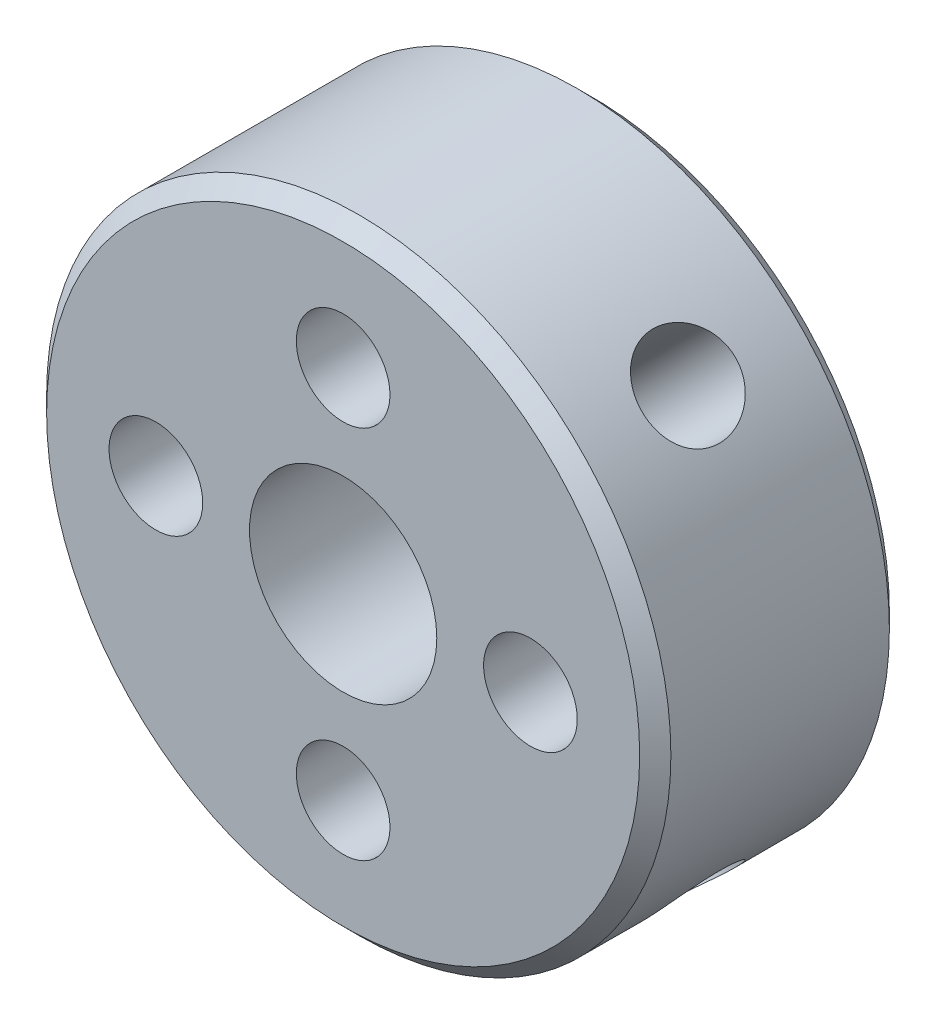
ISO-10303-21;
HEADER;
FILE_DESCRIPTION(('STEP AP214'),'2;1');
FILE_NAME('part.step','',(''),(''),'','','');
FILE_SCHEMA(('AUTOMOTIVE_DESIGN { 1 0 10303 214 1 1 1 1 }'));
ENDSEC;
DATA;
#1=APPLICATION_CONTEXT('core data for automotive mechanical design processes');
#2=APPLICATION_PROTOCOL_DEFINITION('international standard','automotive_design',2000,#1);
#3=PRODUCT_CONTEXT('',#1,'mechanical');
#4=PRODUCT('Part','Part','',(#3));
#5=PRODUCT_RELATED_PRODUCT_CATEGORY('part','',(#4));
#6=PRODUCT_DEFINITION_FORMATION('','',#4);
#7=PRODUCT_DEFINITION_CONTEXT('part definition',#1,'design');
#8=PRODUCT_DEFINITION('design','',#6,#7);
#9=PRODUCT_DEFINITION_SHAPE('','',#8);
#10=(LENGTH_UNIT() NAMED_UNIT(*) SI_UNIT(.MILLI.,.METRE.));
#11=(NAMED_UNIT(*) PLANE_ANGLE_UNIT() SI_UNIT($,.RADIAN.));
#12=(NAMED_UNIT(*) SI_UNIT($,.STERADIAN.) SOLID_ANGLE_UNIT());
#13=UNCERTAINTY_MEASURE_WITH_UNIT(LENGTH_MEASURE(1.E-05),#10,'distance_accuracy_value','');
#14=(GEOMETRIC_REPRESENTATION_CONTEXT(3) GLOBAL_UNCERTAINTY_ASSIGNED_CONTEXT((#13)) GLOBAL_UNIT_ASSIGNED_CONTEXT((#10,
#11,#12)) REPRESENTATION_CONTEXT('',''));
#15=CARTESIAN_POINT('',(0.,0.,0.));
#16=DIRECTION('',(0.,0.,1.));
#17=DIRECTION('',(1.,0.,0.));
#18=AXIS2_PLACEMENT_3D('',#15,#16,#17);
#19=CARTESIAN_POINT('',(0.,0.,8.));
#20=DIRECTION('',(0.,0.,-1.));
#21=DIRECTION('',(-1.,0.,0.));
#22=AXIS2_PLACEMENT_3D('',#19,#20,#21);
#23=CYLINDRICAL_SURFACE('',#22,10.);
#24=CARTESIAN_POINT('',(0.,0.,0.500000000000002));
#25=DIRECTION('',(0.,0.,1.));
#26=DIRECTION('',(1.,0.,0.));
#27=AXIS2_PLACEMENT_3D('',#24,#25,#26);
#28=CIRCLE('',#27,10.);
#29=CARTESIAN_POINT('',(10.,0.,0.500000000000002));
#30=VERTEX_POINT('',#29);
#31=EDGE_CURVE('E42',#30,#30,#28,.T.);
#32=ORIENTED_EDGE('',*,*,#31,.T.);
#33=EDGE_LOOP('',(#32));
#34=FACE_BOUND('',#33,.T.);
#35=CARTESIAN_POINT('',(0.,0.,7.5));
#36=DIRECTION('',(0.,0.,1.));
#37=DIRECTION('',(1.,0.,0.));
#38=AXIS2_PLACEMENT_3D('',#35,#36,#37);
#39=CIRCLE('',#38,10.);
#40=CARTESIAN_POINT('',(10.,0.,7.5));
#41=VERTEX_POINT('',#40);
#42=EDGE_CURVE('E46',#41,#41,#39,.F.);
#43=ORIENTED_EDGE('',*,*,#42,.T.);
#44=EDGE_LOOP('',(#43));
#45=FACE_BOUND('',#44,.T.);
#46=CARTESIAN_POINT('',(5.93040555527496,-8.0517258988346,4.));
#47=CARTESIAN_POINT('',(5.93040899108594,-8.05172444298389,3.91625443071005));
#48=CARTESIAN_POINT('',(5.93614202045911,-8.04751049210588,3.83246024924929));
#49=CARTESIAN_POINT('',(5.95885332008941,-8.03070725438722,3.66721468511687));
#50=CARTESIAN_POINT('',(5.97584255881889,-8.0181097982916,3.58576566851999));
#51=CARTESIAN_POINT('',(6.02035955205701,-7.98473791461494,3.4276262445531));
#52=CARTESIAN_POINT('',(6.04787921857375,-7.96396976226849,3.35093223745785));
#53=CARTESIAN_POINT('',(6.11237336442192,-7.91457730982817,3.20437296922792));
#54=CARTESIAN_POINT('',(6.14934654207741,-7.88595409127691,3.13450676978571));
#55=CARTESIAN_POINT('',(6.23166408721641,-7.82106904568631,3.00301618324567));
#56=CARTESIAN_POINT('',(6.27706649470699,-7.78475399567999,2.94145438659326));
#57=CARTESIAN_POINT('',(6.37442909338175,-7.70523178186016,2.8288625143445));
#58=CARTESIAN_POINT('',(6.42638964489153,-7.66202423931642,2.77783301783301));
#59=CARTESIAN_POINT('',(6.53533339103335,-7.56931634453561,2.68752336830864));
#60=CARTESIAN_POINT('',(6.59233952002671,-7.51978675262899,2.64830084967754));
#61=CARTESIAN_POINT('',(6.70923647587951,-7.41567695049743,2.58308840119183));
#62=CARTESIAN_POINT('',(6.76912715013494,-7.36109700731588,2.55709777215711));
#63=CARTESIAN_POINT('',(6.88939654102741,-7.24865080056696,2.51927661146916));
#64=CARTESIAN_POINT('',(6.94976822170416,-7.19081227463186,2.50734127361284));
#65=CARTESIAN_POINT('',(7.06959508074547,-7.07303897929697,2.49764406517511));
#66=CARTESIAN_POINT('',(7.12905030987486,-7.01310432661308,2.49988140668031));
#67=CARTESIAN_POINT('',(7.24487940676773,-6.89337419593743,2.51838333776243));
#68=CARTESIAN_POINT('',(7.30127417997475,-6.83358146340221,2.53453517179149));
#69=CARTESIAN_POINT('',(7.41004619828203,-6.71547949038114,2.58023060632258));
#70=CARTESIAN_POINT('',(7.46242333993872,-6.65717028811816,2.60977455150144));
#71=CARTESIAN_POINT('',(7.56214337356282,-6.54367798766755,2.6815309969171));
#72=CARTESIAN_POINT('',(7.60946648639261,-6.48850754014474,2.72379096510874));
#73=CARTESIAN_POINT('',(7.69788423704308,-6.38336154841827,2.81974519366999));
#74=CARTESIAN_POINT('',(7.73897846456672,-6.33338634649379,2.87344020670687));
#75=CARTESIAN_POINT('',(7.81455952529844,-6.23989709474696,2.99136844882659));
#76=CARTESIAN_POINT('',(7.84897740417343,-6.19645141998096,3.05570012197012));
#77=CARTESIAN_POINT('',(7.91011579548983,-6.1182138832186,3.19274107712374));
#78=CARTESIAN_POINT('',(7.93683626053028,-6.08342207451324,3.26545041071993));
#79=CARTESIAN_POINT('',(7.98217305968424,-6.02381304647328,3.41728396294065));
#80=CARTESIAN_POINT('',(8.00078306572531,-5.99900361690485,3.49641313366239));
#81=CARTESIAN_POINT('',(8.02957749324963,-5.96040859115874,3.65878525514739));
#82=CARTESIAN_POINT('',(8.03976250854017,-5.94662221806007,3.74202791554676));
#83=CARTESIAN_POINT('',(8.05149378974266,-5.93072894804483,3.90940008957749));
#84=CARTESIAN_POINT('',(8.05312282648841,-5.92851014758075,3.99351318820154));
#85=CARTESIAN_POINT('',(8.04794053203053,-5.93554306966745,4.16099419481734));
#86=CARTESIAN_POINT('',(8.04112946272304,-5.94479443629942,4.24436212585077));
#87=CARTESIAN_POINT('',(8.01922662593605,-5.97430629989806,4.40755981796563));
#88=CARTESIAN_POINT('',(8.00417649164113,-5.99451144092044,4.48740520494161));
#89=CARTESIAN_POINT('',(7.96605027519631,-6.04508394364515,4.64178409204861));
#90=CARTESIAN_POINT('',(7.94297379667765,-6.0754518072152,4.7163173296282));
#91=CARTESIAN_POINT('',(7.88894310849533,-6.14544861409309,4.85857326033505));
#92=CARTESIAN_POINT('',(7.85793089112363,-6.18514556776296,4.92624044727982));
#93=CARTESIAN_POINT('',(7.78861556399052,-6.27220503463211,5.05227285987382));
#94=CARTESIAN_POINT('',(7.75031204195036,-6.31956798127377,5.11063755918116));
#95=CARTESIAN_POINT('',(7.66673645358637,-6.42070736283191,5.21690260663359));
#96=CARTESIAN_POINT('',(7.6214089923518,-6.47453393988641,5.26471172824248));
#97=CARTESIAN_POINT('',(7.52492509881356,-6.58642175261441,5.34787290526265));
#98=CARTESIAN_POINT('',(7.47376882602519,-6.64448287238683,5.38322530146503));
#99=CARTESIAN_POINT('',(7.36697834730602,-6.76268772638434,5.44032374248803));
#100=CARTESIAN_POINT('',(7.31136141742463,-6.82282295626799,5.46211966707837));
#101=CARTESIAN_POINT('',(7.19689080409556,-6.94346258042546,5.49164787953748));
#102=CARTESIAN_POINT('',(7.13803733468611,-7.00396695005269,5.49938109624915));
#103=CARTESIAN_POINT('',(7.01931940397537,-7.12293118201246,5.50054170454941));
#104=CARTESIAN_POINT('',(6.95947052262066,-7.18140527757905,5.49410868087698));
#105=CARTESIAN_POINT('',(6.83996856432094,-7.295316757677,5.46741861157924));
#106=CARTESIAN_POINT('',(6.78031548674997,-7.35075415192535,5.44716161019144));
#107=CARTESIAN_POINT('',(6.66310148888178,-7.45716737725788,5.39344812442977));
#108=CARTESIAN_POINT('',(6.60553907031206,-7.50814644182927,5.36000130486107));
#109=CARTESIAN_POINT('',(6.49431420502485,-7.60455828524601,5.28087251201686));
#110=CARTESIAN_POINT('',(6.44065188499423,-7.6499908839581,5.23519014151966));
#111=CARTESIAN_POINT('',(6.33854232463155,-7.73481317291166,5.13238230117083));
#112=CARTESIAN_POINT('',(6.29014857054964,-7.77414235248672,5.07515377418366));
#113=CARTESIAN_POINT('',(6.20086114735889,-7.84554638422111,4.95109492691953));
#114=CARTESIAN_POINT('',(6.15996924124732,-7.87761953156382,4.88426235617566));
#115=CARTESIAN_POINT('',(6.08700974244396,-7.93413261409575,4.74245101676747));
#116=CARTESIAN_POINT('',(6.05499302685847,-7.95852864371884,4.66742858297817));
#117=CARTESIAN_POINT('',(6.00137997414262,-7.99903602313445,4.5117032232367));
#118=CARTESIAN_POINT('',(5.97977282380163,-8.01515597107382,4.43100629214218));
#119=CARTESIAN_POINT('',(5.95273978437993,-8.03523928527466,4.29162256374353));
#120=CARTESIAN_POINT('',(5.94438140015643,-8.04141644105361,4.23379660307573));
#121=CARTESIAN_POINT('',(5.93321311798502,-8.04966023118407,4.11732170826565));
#122=CARTESIAN_POINT('',(5.93040314811957,-8.05172691881472,4.05867278480039));
#123=CARTESIAN_POINT('',(5.93040555527496,-8.0517258988346,4.));
#124=B_SPLINE_CURVE_WITH_KNOTS('',3,(#46,#47,#48,#49,#50,#51,#52,#53,#54,#55,#56,#57,#58,#59,
#60,#61,#62,#63,#64,#65,#66,#67,#68,#69,#70,#71,#72,#73,#74,#75,#76,#77,#78,#79,#80,#81,#82,#83,
#84,#85,#86,#87,#88,#89,#90,#91,#92,#93,#94,#95,#96,#97,#98,#99,#100,#101,#102,#103,#104,#105,
#106,#107,#108,#109,#110,#111,#112,#113,#114,#115,#116,#117,#118,#119,#120,#121,#122,#123),
.UNSPECIFIED.,.T.,.F.,(4,2,2,2,2,2,2,2,2,2,2,2,2,2,2,2,2,2,2,2,2,2,2,2,2,2,2,2,2,2,2,2,2,2,2,2,
2,2,4),(0.,0.251022251804868,0.502289469561802,0.753364085335673,1.00440414866132,
1.25724158649107,1.51009292207817,1.76415922105782,2.01821209364501,2.27035832534397,
2.52249053939374,2.77259862515728,3.02271314839401,3.27377316386454,3.52484970949272,
3.77839544666269,4.0319427451435,4.28568751773139,4.53941440444341,4.79068214603743,
5.04194209099918,5.29194394807374,5.54195815286117,5.79385486001302,6.04576581461802,
6.29977537753516,6.55377799071854,6.8068404089109,7.05988611170473,7.31044963622327,
7.56101235892823,7.81139182257833,8.06177941567106,8.31450950010969,8.56729890236862,
8.82150878824931,9.07545403445564,9.25132441891613,9.42719252376192),.UNSPECIFIED.);
#125=CARTESIAN_POINT('',(5.93040555527496,-8.0517258988346,4.));
#126=VERTEX_POINT('',#125);
#127=EDGE_CURVE('E90',#126,#126,#124,.T.);
#128=ORIENTED_EDGE('',*,*,#127,.F.);
#129=EDGE_LOOP('',(#128));
#130=FACE_BOUND('',#129,.T.);
#131=CARTESIAN_POINT('',(8.0517258988346,5.93040555527496,4.));
#132=CARTESIAN_POINT('',(8.05172444298389,5.93040899108594,4.08374556928996));
#133=CARTESIAN_POINT('',(8.04751049210588,5.93614202045911,4.16753975075071));
#134=CARTESIAN_POINT('',(8.03070725438722,5.95885332008941,4.33278531488313));
#135=CARTESIAN_POINT('',(8.0181097982916,5.97584255881889,4.41423433148002));
#136=CARTESIAN_POINT('',(7.98473791461494,6.02035955205701,4.5723737554469));
#137=CARTESIAN_POINT('',(7.96396976226849,6.04787921857375,4.64906776254216));
#138=CARTESIAN_POINT('',(7.91457730982817,6.11237336442192,4.79562703077209));
#139=CARTESIAN_POINT('',(7.88595409127691,6.14934654207741,4.8654932302143));
#140=CARTESIAN_POINT('',(7.82106904568631,6.23166408721642,4.99698381675434));
#141=CARTESIAN_POINT('',(7.78475399567998,6.27706649470699,5.05854561340675));
#142=CARTESIAN_POINT('',(7.70523178186016,6.37442909338175,5.17113748565551));
#143=CARTESIAN_POINT('',(7.66202423931642,6.42638964489153,5.22216698216699));
#144=CARTESIAN_POINT('',(7.56931634453561,6.53533339103335,5.31247663169137));
#145=CARTESIAN_POINT('',(7.51978675262899,6.59233952002672,5.35169915032246));
#146=CARTESIAN_POINT('',(7.41567695049743,6.70923647587951,5.41691159880818));
#147=CARTESIAN_POINT('',(7.36109700731588,6.76912715013494,5.4429022278429));
#148=CARTESIAN_POINT('',(7.24865080056696,6.88939654102741,5.48072338853084));
#149=CARTESIAN_POINT('',(7.19081227463186,6.94976822170416,5.49265872638717));
#150=CARTESIAN_POINT('',(7.07303897929697,7.06959508074547,5.5023559348249));
#151=CARTESIAN_POINT('',(7.01310432661308,7.12905030987486,5.50011859331969));
#152=CARTESIAN_POINT('',(6.89337419593742,7.24487940676774,5.48161666223757));
#153=CARTESIAN_POINT('',(6.8335814634022,7.30127417997476,5.46546482820852));
#154=CARTESIAN_POINT('',(6.71547949038114,7.41004619828203,5.41976939367743));
#155=CARTESIAN_POINT('',(6.65717028811816,7.46242333993872,5.39022544849857));
#156=CARTESIAN_POINT('',(6.54367798766755,7.56214337356282,5.31846900308291));
#157=CARTESIAN_POINT('',(6.48850754014474,7.60946648639262,5.27620903489126));
#158=CARTESIAN_POINT('',(6.38336154841827,7.69788423704308,5.18025480633002));
#159=CARTESIAN_POINT('',(6.33338634649379,7.73897846456673,5.12655979329314));
#160=CARTESIAN_POINT('',(6.23989709474696,7.81455952529844,5.00863155117341));
#161=CARTESIAN_POINT('',(6.19645141998096,7.84897740417343,4.94429987802989));
#162=CARTESIAN_POINT('',(6.1182138832186,7.91011579548983,4.80725892287627));
#163=CARTESIAN_POINT('',(6.08342207451324,7.93683626053028,4.73454958928008));
#164=CARTESIAN_POINT('',(6.02381304647328,7.98217305968424,4.58271603705936));
#165=CARTESIAN_POINT('',(5.99900361690485,8.00078306572531,4.50358686633762));
#166=CARTESIAN_POINT('',(5.96040859115874,8.02957749324963,4.34121474485262));
#167=CARTESIAN_POINT('',(5.94662221806007,8.03976250854017,4.25797208445325));
#168=CARTESIAN_POINT('',(5.93072894804482,8.05149378974266,4.09059991042252));
#169=CARTESIAN_POINT('',(5.92851014758075,8.05312282648841,4.00648681179847));
#170=CARTESIAN_POINT('',(5.93554306966745,8.04794053203053,3.83900580518267));
#171=CARTESIAN_POINT('',(5.94479443629942,8.04112946272304,3.75563787414924));
#172=CARTESIAN_POINT('',(5.97430629989806,8.01922662593605,3.59244018203437));
#173=CARTESIAN_POINT('',(5.99451144092044,8.00417649164114,3.5125947950584));
#174=CARTESIAN_POINT('',(6.04508394364515,7.96605027519631,3.3582159079514));
#175=CARTESIAN_POINT('',(6.0754518072152,7.94297379667765,3.28368267037181));
#176=CARTESIAN_POINT('',(6.14544861409309,7.88894310849533,3.14142673966496));
#177=CARTESIAN_POINT('',(6.18514556776296,7.85793089112363,3.07375955272019));
#178=CARTESIAN_POINT('',(6.27220503463211,7.78861556399052,2.94772714012619));
#179=CARTESIAN_POINT('',(6.31956798127377,7.75031204195036,2.88936244081885));
#180=CARTESIAN_POINT('',(6.42070736283191,7.66673645358637,2.78309739336642));
#181=CARTESIAN_POINT('',(6.47453393988641,7.62140899235181,2.73528827175753));
#182=CARTESIAN_POINT('',(6.58642175261441,7.52492509881356,2.65212709473736));
#183=CARTESIAN_POINT('',(6.64448287238683,7.47376882602519,2.61677469853497));
#184=CARTESIAN_POINT('',(6.76268772638434,7.36697834730602,2.55967625751197));
#185=CARTESIAN_POINT('',(6.82282295626799,7.31136141742463,2.53788033292164));
#186=CARTESIAN_POINT('',(6.94346258042546,7.19689080409556,2.50835212046253));
#187=CARTESIAN_POINT('',(7.00396695005269,7.13803733468611,2.50061890375086));
#188=CARTESIAN_POINT('',(7.12293118201246,7.01931940397537,2.4994582954506));
#189=CARTESIAN_POINT('',(7.18140527757905,6.95947052262066,2.50589131912303));
#190=CARTESIAN_POINT('',(7.29531675767699,6.83996856432094,2.53258138842076));
#191=CARTESIAN_POINT('',(7.35075415192535,6.78031548674997,2.55283838980856));
#192=CARTESIAN_POINT('',(7.45716737725788,6.66310148888178,2.60655187557024));
#193=CARTESIAN_POINT('',(7.50814644182927,6.60553907031206,2.63999869513894));
#194=CARTESIAN_POINT('',(7.60455828524601,6.49431420502485,2.71912748798315));
#195=CARTESIAN_POINT('',(7.6499908839581,6.44065188499423,2.76480985848035));
#196=CARTESIAN_POINT('',(7.73481317291166,6.33854232463155,2.86761769882918));
#197=CARTESIAN_POINT('',(7.77414235248672,6.29014857054964,2.92484622581634));
#198=CARTESIAN_POINT('',(7.84554638422111,6.20086114735889,3.04890507308048));
#199=CARTESIAN_POINT('',(7.87761953156382,6.15996924124732,3.11573764382435));
#200=CARTESIAN_POINT('',(7.93413261409574,6.08700974244397,3.25754898323254));
#201=CARTESIAN_POINT('',(7.95852864371884,6.05499302685847,3.33257141702183));
#202=CARTESIAN_POINT('',(7.99903602313445,6.00137997414262,3.4882967767633));
#203=CARTESIAN_POINT('',(8.01515597107382,5.97977282380164,3.56899370785783));
#204=CARTESIAN_POINT('',(8.03523928527466,5.95273978437993,3.70837743625648));
#205=CARTESIAN_POINT('',(8.04141644105361,5.94438140015643,3.76620339692428));
#206=CARTESIAN_POINT('',(8.04966023118407,5.93321311798502,3.88267829173435));
#207=CARTESIAN_POINT('',(8.05172691881472,5.93040314811957,3.94132721519962));
#208=CARTESIAN_POINT('',(8.0517258988346,5.93040555527496,4.));
#209=B_SPLINE_CURVE_WITH_KNOTS('',3,(#131,#132,#133,#134,#135,#136,#137,#138,#139,#140,#141,
#142,#143,#144,#145,#146,#147,#148,#149,#150,#151,#152,#153,#154,#155,#156,#157,#158,#159,#160,
#161,#162,#163,#164,#165,#166,#167,#168,#169,#170,#171,#172,#173,#174,#175,#176,#177,#178,#179,
#180,#181,#182,#183,#184,#185,#186,#187,#188,#189,#190,#191,#192,#193,#194,#195,#196,#197,#198,
#199,#200,#201,#202,#203,#204,#205,#206,#207,#208),.UNSPECIFIED.,.T.,.F.,(4,2,2,2,2,2,2,2,2,2,2,
2,2,2,2,2,2,2,2,2,2,2,2,2,2,2,2,2,2,2,2,2,2,2,2,2,2,2,4),(0.,0.251022251804868,
0.502289469561802,0.753364085335674,1.00440414866133,1.25724158649107,1.51009292207817,
1.76415922105782,2.018212093645,2.27035832534397,2.52249053939374,2.77259862515728,
3.02271314839401,3.27377316386454,3.52484970949272,3.77839544666269,4.0319427451435,
4.28568751773138,4.53941440444341,4.79068214603744,5.04194209099918,5.29194394807374,
5.54195815286117,5.79385486001302,6.04576581461802,6.29977537753516,6.55377799071855,
6.8068404089109,7.05988611170473,7.31044963622327,7.56101235892823,7.81139182257833,
8.06177941567107,8.3145095001097,8.56729890236863,8.82150878824932,9.07545403445564,
9.25132441891613,9.42719252376192),.UNSPECIFIED.);
#210=CARTESIAN_POINT('',(8.0517258988346,5.93040555527496,4.));
#211=VERTEX_POINT('',#210);
#212=EDGE_CURVE('E82',#211,#211,#209,.T.);
#213=ORIENTED_EDGE('',*,*,#212,.T.);
#214=EDGE_LOOP('',(#213));
#215=FACE_BOUND('',#214,.T.);
#216=ADVANCED_FACE('F31',(#34,#45,#130,#215),#23,.T.);
#217=CARTESIAN_POINT('',(0.,0.,8.));
#218=DIRECTION('',(0.,0.,-1.));
#219=DIRECTION('',(-1.,0.,0.));
#220=AXIS2_PLACEMENT_3D('',#217,#218,#219);
#221=CYLINDRICAL_SURFACE('',#220,3.);
#222=CARTESIAN_POINT('',(0.776457135307565,-2.89777747886721,4.));
#223=CARTESIAN_POINT('',(0.776465807945209,-2.89777843642086,3.92183828770713));
#224=CARTESIAN_POINT('',(0.783337885586098,-2.89596075365292,3.84357788271244));
#225=CARTESIAN_POINT('',(0.810238787422552,-2.88854556363685,3.68945910298427));
#226=CARTESIAN_POINT('',(0.830295257550601,-2.88294011324794,3.61360612743489));
#227=CARTESIAN_POINT('',(0.881825990933506,-2.86759385571556,3.46682250348409));
#228=CARTESIAN_POINT('',(0.913239525995621,-2.85787499736417,3.39586802128962));
#229=CARTESIAN_POINT('',(0.985522074791568,-2.83375960105533,3.25986369700492));
#230=CARTESIAN_POINT('',(1.02639160004348,-2.81936281002992,3.19481417460632));
#231=CARTESIAN_POINT('',(1.11931695974479,-2.78384605508351,3.06654140716375));
#232=CARTESIAN_POINT('',(1.17201739854081,-2.7622695134035,3.00391129648969));
#233=CARTESIAN_POINT('',(1.28389309696414,-2.7120800954357,2.88788741738994));
#234=CARTESIAN_POINT('',(1.34307156240821,-2.68346372649268,2.83449825612472));
#235=CARTESIAN_POINT('',(1.4697835351575,-2.61633504151045,2.73494927327851));
#236=CARTESIAN_POINT('',(1.53761134146163,-2.57728569203884,2.68951934821071));
#237=CARTESIAN_POINT('',(1.67515420911279,-2.4900743247597,2.61228872013136));
#238=CARTESIAN_POINT('',(1.74486804977895,-2.44191808567332,2.58047941579425));
#239=CARTESIAN_POINT('',(1.87817425418938,-2.34071742954988,2.53374300804836));
#240=CARTESIAN_POINT('',(1.94184923030434,-2.28826464060798,2.5177757104667));
#241=CARTESIAN_POINT('',(2.06564121032913,-2.1771603544596,2.49975082198745));
#242=CARTESIAN_POINT('',(2.12576034519837,-2.11851262971613,2.49768481480644));
#243=CARTESIAN_POINT('',(2.23530137136982,-2.00231140292521,2.50712001095553));
#244=CARTESIAN_POINT('',(2.28519887174933,-1.94510625043172,2.51745702328184));
#245=CARTESIAN_POINT('',(2.37912040040672,-1.8290328206712,2.54932126585699));
#246=CARTESIAN_POINT('',(2.42314398886576,-1.77016441926511,2.57084933346434));
#247=CARTESIAN_POINT('',(2.50530608030927,-1.65187898356767,2.62462384913472));
#248=CARTESIAN_POINT('',(2.54335473361967,-1.59246562724667,2.6570144697581));
#249=CARTESIAN_POINT('',(2.61278069336991,-1.47580220064365,2.73139512430224));
#250=CARTESIAN_POINT('',(2.64415560358889,-1.41855291342132,2.77338859495353));
#251=CARTESIAN_POINT('',(2.70321718660422,-1.30277736945863,2.87034302729953));
#252=CARTESIAN_POINT('',(2.73027487166611,-1.2446419510183,2.92615454248902));
#253=CARTESIAN_POINT('',(2.77749540009897,-1.13537205134786,3.04688458739527));
#254=CARTESIAN_POINT('',(2.79765294762602,-1.08424296543308,3.1118100584111));
#255=CARTESIAN_POINT('',(2.83296699306694,-0.988467637856778,3.25397228863613));
#256=CARTESIAN_POINT('',(2.84772461492292,-0.944439272066019,3.33172903458132));
#257=CARTESIAN_POINT('',(2.87128516634125,-0.870203141463101,3.4944065070385));
#258=CARTESIAN_POINT('',(2.88009431275189,-0.839980958308249,3.57931964952635));
#259=CARTESIAN_POINT('',(2.8920242052622,-0.797898740855281,3.74682176692419));
#260=CARTESIAN_POINT('',(2.89554041189933,-0.784773377993307,3.82906167856533));
#261=CARTESIAN_POINT('',(2.89846195751578,-0.773923684249224,3.99460201227482));
#262=CARTESIAN_POINT('',(2.89787020033614,-0.776188474338464,4.07790164367969));
#263=CARTESIAN_POINT('',(2.89282271219333,-0.794760432934035,4.2334808778681));
#264=CARTESIAN_POINT('',(2.88879674637904,-0.809504390277577,4.3059691766619));
#265=CARTESIAN_POINT('',(2.87718549622091,-0.849847525365749,4.44755167940644));
#266=CARTESIAN_POINT('',(2.86959905914146,-0.875450218468108,4.51664477611992));
#267=CARTESIAN_POINT('',(2.85000428601381,-0.93732091358477,4.65311699635405));
#268=CARTESIAN_POINT('',(2.83780742241691,-0.974027961374803,4.72026852528033));
#269=CARTESIAN_POINT('',(2.80846718922543,-1.05564763070854,4.84820390730849));
#270=CARTESIAN_POINT('',(2.79132127696574,-1.10056446582024,4.90898446526993));
#271=CARTESIAN_POINT('',(2.74893115939282,-1.20283404947151,5.03046815128533));
#272=CARTESIAN_POINT('',(2.72293857041294,-1.26104068458325,5.09019572607649));
#273=CARTESIAN_POINT('',(2.66304918010131,-1.38303494861758,5.19911835699039));
#274=CARTESIAN_POINT('',(2.62914971686415,-1.44682445252411,5.24830985534581));
#275=CARTESIAN_POINT('',(2.55189425785636,-1.57919386501897,5.33586058892516));
#276=CARTESIAN_POINT('',(2.50831229866665,-1.64785576996501,5.37389967731637));
#277=CARTESIAN_POINT('',(2.41231873467998,-1.78542113059001,5.43570685578609));
#278=CARTESIAN_POINT('',(2.35991493507781,-1.85432432047734,5.45948747704946));
#279=CARTESIAN_POINT('',(2.25247602694357,-1.98311144359732,5.490052846262));
#280=CARTESIAN_POINT('',(2.19812351338379,-2.04324285223115,5.49819681381417));
#281=CARTESIAN_POINT('',(2.08451046937594,-2.15902393796182,5.50126489818161));
#282=CARTESIAN_POINT('',(2.02525166408007,-2.21467517691624,5.49619364278535));
#283=CARTESIAN_POINT('',(1.90791731594304,-2.31635207595353,5.47387538980657));
#284=CARTESIAN_POINT('',(1.85002110919703,-2.36277036625902,5.4574527261135));
#285=CARTESIAN_POINT('',(1.73362251777721,-2.44945348099617,5.41400950104555));
#286=CARTESIAN_POINT('',(1.67512004734522,-2.48971742182762,5.38698741985982));
#287=CARTESIAN_POINT('',(1.5568750791499,-2.56540042262159,5.32190942175104));
#288=CARTESIAN_POINT('',(1.49718656380225,-2.60053861020872,5.28343101518824));
#289=CARTESIAN_POINT('',(1.38109270507128,-2.66401345602037,5.19706310371143));
#290=CARTESIAN_POINT('',(1.32468888511395,-2.69234697700719,5.14916927632649));
#291=CARTESIAN_POINT('',(1.21166858581717,-2.74520076947935,5.03980429146595));
#292=CARTESIAN_POINT('',(1.15558958126822,-2.76906092274574,4.97745626878421));
#293=CARTESIAN_POINT('',(1.05214039162087,-2.8100006811322,4.84382391830535));
#294=CARTESIAN_POINT('',(1.00477791984151,-2.8270742961439,4.77253176869848));
#295=CARTESIAN_POINT('',(0.920191613571826,-2.85575022521723,4.62004503012857));
#296=CARTESIAN_POINT('',(0.883335479265523,-2.86716258468163,4.5386087033069));
#297=CARTESIAN_POINT('',(0.824963295294622,-2.88450805289951,4.37000139349033));
#298=CARTESIAN_POINT('',(0.803395954954622,-2.89045950183027,4.28285066663097));
#299=CARTESIAN_POINT('',(0.785870399492768,-2.89524136224008,4.16229196652201));
#300=CARTESIAN_POINT('',(0.782348442320769,-2.89619347565166,4.12994815840318));
#301=CARTESIAN_POINT('',(0.777639926487406,-2.89746135588973,4.06507527897664));
#302=CARTESIAN_POINT('',(0.77645352405915,-2.89777708014605,4.03254619542119));
#303=CARTESIAN_POINT('',(0.776457135307565,-2.89777747886721,4.));
#304=B_SPLINE_CURVE_WITH_KNOTS('',3,(#222,#223,#224,#225,#226,#227,#228,#229,#230,#231,#232,
#233,#234,#235,#236,#237,#238,#239,#240,#241,#242,#243,#244,#245,#246,#247,#248,#249,#250,#251,
#252,#253,#254,#255,#256,#257,#258,#259,#260,#261,#262,#263,#264,#265,#266,#267,#268,#269,#270,
#271,#272,#273,#274,#275,#276,#277,#278,#279,#280,#281,#282,#283,#284,#285,#286,#287,#288,#289,
#290,#291,#292,#293,#294,#295,#296,#297,#298,#299,#300,#301,#302,#303),.UNSPECIFIED.,.T.,.F.,(4,
2,2,2,2,2,2,2,2,2,2,2,2,2,2,2,2,2,2,2,2,2,2,2,2,2,2,2,2,2,2,2,2,2,2,2,2,2,2,2,4),(0.,
0.234348183892073,0.469189339237207,0.702792893878328,0.936409088167724,1.18929346874735,
1.44230356626556,1.71236838358145,1.98226240445836,2.23295227451903,2.4834903552906,
2.71224146226808,2.94100968776183,3.1729430209672,3.40495949025408,3.65890787185336,
3.91305072368878,4.18333262594173,4.45333161317557,4.70193436281318,4.9503613978256,
5.17161275136038,5.39293578654095,5.62450944609131,5.85620229330071,6.1171011537092,
6.37808797467303,6.64596272119449,6.91360169713158,7.1566840558423,7.39968130190958,
7.62666637307239,7.8536840026802,8.09041126079208,8.32724745151079,8.58765362775101,
8.84828914267731,9.11716123557908,9.3851269950414,9.48270202777964,9.58028358741811),.UNSPECIFIED.);
#305=CARTESIAN_POINT('',(0.776457135307565,-2.89777747886721,4.));
#306=VERTEX_POINT('',#305);
#307=EDGE_CURVE('E112',#306,#306,#304,.T.);
#308=ORIENTED_EDGE('',*,*,#307,.T.);
#309=EDGE_LOOP('',(#308));
#310=FACE_BOUND('',#309,.T.);
#311=CARTESIAN_POINT('',(0.,0.,0.));
#312=DIRECTION('',(0.,0.,1.));
#313=DIRECTION('',(1.,0.,0.));
#314=AXIS2_PLACEMENT_3D('',#311,#312,#313);
#315=CIRCLE('',#314,3.);
#316=CARTESIAN_POINT('',(3.,0.,0.));
#317=VERTEX_POINT('',#316);
#318=EDGE_CURVE('E52',#317,#317,#315,.T.);
#319=ORIENTED_EDGE('',*,*,#318,.F.);
#320=EDGE_LOOP('',(#319));
#321=FACE_BOUND('',#320,.T.);
#322=CARTESIAN_POINT('',(0.,0.,8.));
#323=DIRECTION('',(0.,0.,1.));
#324=DIRECTION('',(1.,0.,0.));
#325=AXIS2_PLACEMENT_3D('',#322,#323,#324);
#326=CIRCLE('',#325,3.);
#327=CARTESIAN_POINT('',(3.,0.,8.));
#328=VERTEX_POINT('',#327);
#329=EDGE_CURVE('E51',#328,#328,#326,.T.);
#330=ORIENTED_EDGE('',*,*,#329,.T.);
#331=EDGE_LOOP('',(#330));
#332=FACE_BOUND('',#331,.T.);
#333=CARTESIAN_POINT('',(2.89777747886721,0.776457135307565,4.));
#334=CARTESIAN_POINT('',(2.89777843642087,0.776465807945207,4.07816171229288));
#335=CARTESIAN_POINT('',(2.89596075365292,0.783337885586098,4.15642211728757));
#336=CARTESIAN_POINT('',(2.88854556363685,0.810238787422553,4.31054089701573));
#337=CARTESIAN_POINT('',(2.88294011324794,0.830295257550602,4.38639387256512));
#338=CARTESIAN_POINT('',(2.86759385571556,0.881825990933507,4.53317749651592));
#339=CARTESIAN_POINT('',(2.85787499736417,0.913239525995622,4.60413197871038));
#340=CARTESIAN_POINT('',(2.83375960105533,0.98552207479157,4.74013630299508));
#341=CARTESIAN_POINT('',(2.81936281002992,1.02639160004348,4.80518582539369));
#342=CARTESIAN_POINT('',(2.78384605508351,1.11931695974479,4.93345859283626));
#343=CARTESIAN_POINT('',(2.7622695134035,1.17201739854081,4.99608870351032));
#344=CARTESIAN_POINT('',(2.7120800954357,1.28389309696414,5.11211258261007));
#345=CARTESIAN_POINT('',(2.68346372649268,1.34307156240821,5.16550174387528));
#346=CARTESIAN_POINT('',(2.61633504151045,1.4697835351575,5.2650507267215));
#347=CARTESIAN_POINT('',(2.57728569203884,1.53761134146163,5.3104806517893));
#348=CARTESIAN_POINT('',(2.4900743247597,1.67515420911279,5.38771127986865));
#349=CARTESIAN_POINT('',(2.44191808567332,1.74486804977895,5.41952058420576));
#350=CARTESIAN_POINT('',(2.34071742954988,1.87817425418938,5.46625699195165));
#351=CARTESIAN_POINT('',(2.28826464060798,1.94184923030434,5.4822242895333));
#352=CARTESIAN_POINT('',(2.1771603544596,2.06564121032913,5.50024917801256));
#353=CARTESIAN_POINT('',(2.11851262971613,2.12576034519837,5.50231518519357));
#354=CARTESIAN_POINT('',(2.00231140292521,2.23530137136982,5.49287998904448));
#355=CARTESIAN_POINT('',(1.94510625043172,2.28519887174933,5.48254297671817));
#356=CARTESIAN_POINT('',(1.8290328206712,2.37912040040672,5.45067873414302));
#357=CARTESIAN_POINT('',(1.77016441926511,2.42314398886576,5.42915066653567));
#358=CARTESIAN_POINT('',(1.65187898356767,2.50530608030927,5.37537615086528));
#359=CARTESIAN_POINT('',(1.59246562724667,2.54335473361967,5.3429855302419));
#360=CARTESIAN_POINT('',(1.47580220064365,2.61278069336991,5.26860487569776));
#361=CARTESIAN_POINT('',(1.41855291342132,2.64415560358889,5.22661140504648));
#362=CARTESIAN_POINT('',(1.30277736945863,2.70321718660422,5.12965697270048));
#363=CARTESIAN_POINT('',(1.2446419510183,2.73027487166611,5.07384545751099));
#364=CARTESIAN_POINT('',(1.13537205134786,2.77749540009897,4.95311541260474));
#365=CARTESIAN_POINT('',(1.08424296543308,2.79765294762602,4.88818994158891));
#366=CARTESIAN_POINT('',(0.988467637856776,2.83296699306694,4.74602771136387));
#367=CARTESIAN_POINT('',(0.944439272066017,2.84772461492292,4.66827096541869));
#368=CARTESIAN_POINT('',(0.8702031414631,2.87128516634125,4.5055934929615));
#369=CARTESIAN_POINT('',(0.83998095830825,2.88009431275189,4.42068035047366));
#370=CARTESIAN_POINT('',(0.797898740855282,2.8920242052622,4.25317823307582));
#371=CARTESIAN_POINT('',(0.784773377993308,2.89554041189933,4.17093832143467));
#372=CARTESIAN_POINT('',(0.773923684249222,2.89846195751578,4.00539798772519));
#373=CARTESIAN_POINT('',(0.776188474338462,2.89787020033614,3.92209835632032));
#374=CARTESIAN_POINT('',(0.794760432934033,2.89282271219333,3.76651912213191));
#375=CARTESIAN_POINT('',(0.809504390277576,2.88879674637904,3.69403082333811));
#376=CARTESIAN_POINT('',(0.849847525365749,2.87718549622091,3.55244832059357));
#377=CARTESIAN_POINT('',(0.875450218468107,2.86959905914146,3.48335522388009));
#378=CARTESIAN_POINT('',(0.937320913584768,2.85000428601381,3.34688300364596));
#379=CARTESIAN_POINT('',(0.974027961374802,2.83780742241691,3.27973147471968));
#380=CARTESIAN_POINT('',(1.05564763070854,2.80846718922543,3.15179609269151));
#381=CARTESIAN_POINT('',(1.10056446582024,2.79132127696574,3.09101553473008));
#382=CARTESIAN_POINT('',(1.20283404947151,2.74893115939282,2.96953184871468));
#383=CARTESIAN_POINT('',(1.26104068458325,2.72293857041294,2.90980427392351));
#384=CARTESIAN_POINT('',(1.38303494861757,2.66304918010131,2.80088164300962));
#385=CARTESIAN_POINT('',(1.4468244525241,2.62914971686415,2.75169014465419));
#386=CARTESIAN_POINT('',(1.57919386501897,2.55189425785636,2.66413941107485));
#387=CARTESIAN_POINT('',(1.647855769965,2.50831229866665,2.62610032268364));
#388=CARTESIAN_POINT('',(1.78542113059,2.41231873467999,2.56429314421391));
#389=CARTESIAN_POINT('',(1.85432432047734,2.35991493507781,2.54051252295055));
#390=CARTESIAN_POINT('',(1.98311144359732,2.25247602694357,2.50994715373801));
#391=CARTESIAN_POINT('',(2.04324285223115,2.19812351338379,2.50180318618583));
#392=CARTESIAN_POINT('',(2.15902393796182,2.08451046937594,2.4987351018184));
#393=CARTESIAN_POINT('',(2.21467517691624,2.02525166408007,2.50380635721466));
#394=CARTESIAN_POINT('',(2.31635207595353,1.90791731594304,2.52612461019344));
#395=CARTESIAN_POINT('',(2.36277036625901,1.85002110919703,2.54254727388651));
#396=CARTESIAN_POINT('',(2.44945348099617,1.73362251777721,2.58599049895446));
#397=CARTESIAN_POINT('',(2.48971742182762,1.67512004734522,2.61301258014018));
#398=CARTESIAN_POINT('',(2.56540042262159,1.5568750791499,2.67809057824896));
#399=CARTESIAN_POINT('',(2.60053861020872,1.49718656380225,2.71656898481176));
#400=CARTESIAN_POINT('',(2.66401345602037,1.38109270507128,2.80293689628858));
#401=CARTESIAN_POINT('',(2.69234697700719,1.32468888511395,2.85083072367351));
#402=CARTESIAN_POINT('',(2.74520076947935,1.21166858581717,2.96019570853406));
#403=CARTESIAN_POINT('',(2.76906092274574,1.15558958126822,3.02254373121579));
#404=CARTESIAN_POINT('',(2.8100006811322,1.05214039162087,3.15617608169466));
#405=CARTESIAN_POINT('',(2.8270742961439,1.00477791984151,3.22746823130153));
#406=CARTESIAN_POINT('',(2.85575022521723,0.920191613571826,3.37995496987144));
#407=CARTESIAN_POINT('',(2.86716258468163,0.883335479265525,3.46139129669311));
#408=CARTESIAN_POINT('',(2.88450805289951,0.824963295294622,3.62999860650967));
#409=CARTESIAN_POINT('',(2.89045950183027,0.803395954954619,3.71714933336903));
#410=CARTESIAN_POINT('',(2.89524136224008,0.785870399492768,3.837708033478));
#411=CARTESIAN_POINT('',(2.89619347565166,0.782348442320771,3.87005184159683));
#412=CARTESIAN_POINT('',(2.89746135588973,0.777639926487408,3.93492472102337));
#413=CARTESIAN_POINT('',(2.89777708014605,0.776453524059151,3.96745380457882));
#414=CARTESIAN_POINT('',(2.89777747886721,0.776457135307565,4.));
#415=B_SPLINE_CURVE_WITH_KNOTS('',3,(#333,#334,#335,#336,#337,#338,#339,#340,#341,#342,#343,
#344,#345,#346,#347,#348,#349,#350,#351,#352,#353,#354,#355,#356,#357,#358,#359,#360,#361,#362,
#363,#364,#365,#366,#367,#368,#369,#370,#371,#372,#373,#374,#375,#376,#377,#378,#379,#380,#381,
#382,#383,#384,#385,#386,#387,#388,#389,#390,#391,#392,#393,#394,#395,#396,#397,#398,#399,#400,
#401,#402,#403,#404,#405,#406,#407,#408,#409,#410,#411,#412,#413,#414),.UNSPECIFIED.,.T.,.F.,(4,
2,2,2,2,2,2,2,2,2,2,2,2,2,2,2,2,2,2,2,2,2,2,2,2,2,2,2,2,2,2,2,2,2,2,2,2,2,2,2,4),(0.,
0.234348183892074,0.469189339237207,0.702792893878328,0.936409088167724,1.18929346874735,
1.44230356626556,1.71236838358145,1.98226240445836,2.23295227451903,2.4834903552906,
2.71224146226807,2.94100968776183,3.1729430209672,3.40495949025408,3.65890787185336,
3.91305072368878,4.18333262594173,4.45333161317557,4.70193436281318,4.9503613978256,
5.17161275136038,5.39293578654095,5.62450944609132,5.85620229330071,6.1171011537092,
6.37808797467303,6.64596272119449,6.91360169713157,7.1566840558423,7.39968130190958,
7.62666637307239,7.8536840026802,8.09041126079208,8.32724745151079,8.58765362775102,
8.84828914267732,9.11716123557908,9.38512699504141,9.48270202777964,9.58028358741811),.UNSPECIFIED.);
#416=CARTESIAN_POINT('',(2.89777747886721,0.776457135307565,4.));
#417=VERTEX_POINT('',#416);
#418=EDGE_CURVE('E79',#417,#417,#415,.T.);
#419=ORIENTED_EDGE('',*,*,#418,.F.);
#420=EDGE_LOOP('',(#419));
#421=FACE_BOUND('',#420,.T.);
#422=ADVANCED_FACE('F125',(#310,#321,#332,#421),#221,.F.);
#423=CARTESIAN_POINT('',(0.,0.,8.));
#424=DIRECTION('',(0.,0.,1.));
#425=DIRECTION('',(1.,0.,0.));
#426=AXIS2_PLACEMENT_3D('',#423,#424,#425);
#427=PLANE('',#426);
#428=CARTESIAN_POINT('',(0.,0.,8.));
#429=DIRECTION('',(0.,0.,1.));
#430=DIRECTION('',(1.,0.,0.));
#431=AXIS2_PLACEMENT_3D('',#428,#429,#430);
#432=CIRCLE('',#431,9.50000000000001);
#433=CARTESIAN_POINT('',(9.50000000000001,0.,8.));
#434=VERTEX_POINT('',#433);
#435=EDGE_CURVE('E10',#434,#434,#432,.T.);
#436=ORIENTED_EDGE('',*,*,#435,.T.);
#437=EDGE_LOOP('',(#436));
#438=FACE_BOUND('',#437,.T.);
#439=CARTESIAN_POINT('',(0.,-6.,8.));
#440=DIRECTION('',(0.,0.,1.));
#441=DIRECTION('',(1.,0.,0.));
#442=AXIS2_PLACEMENT_3D('',#439,#440,#441);
#443=CIRCLE('',#442,1.5);
#444=CARTESIAN_POINT('',(1.5,-6.,8.));
#445=VERTEX_POINT('',#444);
#446=EDGE_CURVE('E67',#445,#445,#443,.T.);
#447=ORIENTED_EDGE('',*,*,#446,.F.);
#448=EDGE_LOOP('',(#447));
#449=FACE_BOUND('',#448,.T.);
#450=CARTESIAN_POINT('',(-6.,0.,8.));
#451=DIRECTION('',(0.,0.,1.));
#452=DIRECTION('',(1.,0.,0.));
#453=AXIS2_PLACEMENT_3D('',#450,#451,#452);
#454=CIRCLE('',#453,1.5);
#455=CARTESIAN_POINT('',(-4.5,0.,8.));
#456=VERTEX_POINT('',#455);
#457=EDGE_CURVE('E55',#456,#456,#454,.T.);
#458=ORIENTED_EDGE('',*,*,#457,.F.);
#459=EDGE_LOOP('',(#458));
#460=FACE_BOUND('',#459,.T.);
#461=ORIENTED_EDGE('',*,*,#329,.F.);
#462=EDGE_LOOP('',(#461));
#463=FACE_BOUND('',#462,.T.);
#464=CARTESIAN_POINT('',(6.,0.,8.));
#465=DIRECTION('',(0.,0.,1.));
#466=DIRECTION('',(1.,0.,0.));
#467=AXIS2_PLACEMENT_3D('',#464,#465,#466);
#468=CIRCLE('',#467,1.5);
#469=CARTESIAN_POINT('',(7.5,0.,8.));
#470=VERTEX_POINT('',#469);
#471=EDGE_CURVE('E61',#470,#470,#468,.T.);
#472=ORIENTED_EDGE('',*,*,#471,.F.);
#473=EDGE_LOOP('',(#472));
#474=FACE_BOUND('',#473,.T.);
#475=CARTESIAN_POINT('',(0.,6.,8.));
#476=DIRECTION('',(0.,0.,1.));
#477=DIRECTION('',(1.,0.,0.));
#478=AXIS2_PLACEMENT_3D('',#475,#476,#477);
#479=CIRCLE('',#478,1.5);
#480=CARTESIAN_POINT('',(1.5,6.,8.));
#481=VERTEX_POINT('',#480);
#482=EDGE_CURVE('E73',#481,#481,#479,.T.);
#483=ORIENTED_EDGE('',*,*,#482,.F.);
#484=EDGE_LOOP('',(#483));
#485=FACE_BOUND('',#484,.T.);
#486=ADVANCED_FACE('F128',(#438,#449,#460,#463,#474,#485),#427,.T.);
#487=CARTESIAN_POINT('',(0.,0.,0.));
#488=DIRECTION('',(0.,0.,1.));
#489=DIRECTION('',(1.,0.,0.));
#490=AXIS2_PLACEMENT_3D('',#487,#488,#489);
#491=PLANE('',#490);
#492=CARTESIAN_POINT('',(0.,0.,0.));
#493=DIRECTION('',(0.,0.,1.));
#494=DIRECTION('',(1.,0.,0.));
#495=AXIS2_PLACEMENT_3D('',#492,#493,#494);
#496=CIRCLE('',#495,9.5);
#497=CARTESIAN_POINT('',(9.5,0.,0.));
#498=VERTEX_POINT('',#497);
#499=EDGE_CURVE('E38',#498,#498,#496,.F.);
#500=ORIENTED_EDGE('',*,*,#499,.T.);
#501=EDGE_LOOP('',(#500));
#502=FACE_BOUND('',#501,.T.);
#503=ORIENTED_EDGE('',*,*,#318,.T.);
#504=EDGE_LOOP('',(#503));
#505=FACE_BOUND('',#504,.T.);
#506=CARTESIAN_POINT('',(-6.,0.,0.));
#507=DIRECTION('',(0.,0.,1.));
#508=DIRECTION('',(1.,0.,0.));
#509=AXIS2_PLACEMENT_3D('',#506,#507,#508);
#510=CIRCLE('',#509,1.5);
#511=CARTESIAN_POINT('',(-4.5,0.,0.));
#512=VERTEX_POINT('',#511);
#513=EDGE_CURVE('E58',#512,#512,#510,.T.);
#514=ORIENTED_EDGE('',*,*,#513,.T.);
#515=EDGE_LOOP('',(#514));
#516=FACE_BOUND('',#515,.T.);
#517=CARTESIAN_POINT('',(6.,0.,0.));
#518=DIRECTION('',(0.,0.,1.));
#519=DIRECTION('',(1.,0.,0.));
#520=AXIS2_PLACEMENT_3D('',#517,#518,#519);
#521=CIRCLE('',#520,1.5);
#522=CARTESIAN_POINT('',(7.5,0.,0.));
#523=VERTEX_POINT('',#522);
#524=EDGE_CURVE('E64',#523,#523,#521,.T.);
#525=ORIENTED_EDGE('',*,*,#524,.T.);
#526=EDGE_LOOP('',(#525));
#527=FACE_BOUND('',#526,.T.);
#528=CARTESIAN_POINT('',(0.,-6.,0.));
#529=DIRECTION('',(0.,0.,1.));
#530=DIRECTION('',(1.,0.,0.));
#531=AXIS2_PLACEMENT_3D('',#528,#529,#530);
#532=CIRCLE('',#531,1.5);
#533=CARTESIAN_POINT('',(1.5,-6.,0.));
#534=VERTEX_POINT('',#533);
#535=EDGE_CURVE('E70',#534,#534,#532,.T.);
#536=ORIENTED_EDGE('',*,*,#535,.T.);
#537=EDGE_LOOP('',(#536));
#538=FACE_BOUND('',#537,.T.);
#539=CARTESIAN_POINT('',(0.,6.,0.));
#540=DIRECTION('',(0.,0.,1.));
#541=DIRECTION('',(1.,0.,0.));
#542=AXIS2_PLACEMENT_3D('',#539,#540,#541);
#543=CIRCLE('',#542,1.5);
#544=CARTESIAN_POINT('',(1.5,6.,0.));
#545=VERTEX_POINT('',#544);
#546=EDGE_CURVE('E76',#545,#545,#543,.T.);
#547=ORIENTED_EDGE('',*,*,#546,.T.);
#548=EDGE_LOOP('',(#547));
#549=FACE_BOUND('',#548,.T.);
#550=ADVANCED_FACE('F149',(#502,#505,#516,#527,#538,#549),#491,.F.);
#551=CARTESIAN_POINT('',(-6.,0.,8.));
#552=DIRECTION('',(0.,0.,-1.));
#553=DIRECTION('',(-1.,0.,0.));
#554=AXIS2_PLACEMENT_3D('',#551,#552,#553);
#555=CYLINDRICAL_SURFACE('',#554,1.5);
#556=ORIENTED_EDGE('',*,*,#457,.T.);
#557=EDGE_LOOP('',(#556));
#558=FACE_BOUND('',#557,.T.);
#559=ORIENTED_EDGE('',*,*,#513,.F.);
#560=EDGE_LOOP('',(#559));
#561=FACE_BOUND('',#560,.T.);
#562=ADVANCED_FACE('F178',(#558,#561),#555,.F.);
#563=CARTESIAN_POINT('',(6.,0.,8.));
#564=DIRECTION('',(0.,0.,-1.));
#565=DIRECTION('',(-1.,0.,0.));
#566=AXIS2_PLACEMENT_3D('',#563,#564,#565);
#567=CYLINDRICAL_SURFACE('',#566,1.5);
#568=ORIENTED_EDGE('',*,*,#471,.T.);
#569=EDGE_LOOP('',(#568));
#570=FACE_BOUND('',#569,.T.);
#571=ORIENTED_EDGE('',*,*,#524,.F.);
#572=EDGE_LOOP('',(#571));
#573=FACE_BOUND('',#572,.T.);
#574=ADVANCED_FACE('F225',(#570,#573),#567,.F.);
#575=CARTESIAN_POINT('',(0.,-6.,8.));
#576=DIRECTION('',(0.,0.,-1.));
#577=DIRECTION('',(-1.,0.,0.));
#578=AXIS2_PLACEMENT_3D('',#575,#576,#577);
#579=CYLINDRICAL_SURFACE('',#578,1.5);
#580=ORIENTED_EDGE('',*,*,#446,.T.);
#581=EDGE_LOOP('',(#580));
#582=FACE_BOUND('',#581,.T.);
#583=ORIENTED_EDGE('',*,*,#535,.F.);
#584=EDGE_LOOP('',(#583));
#585=FACE_BOUND('',#584,.T.);
#586=ADVANCED_FACE('F216',(#582,#585),#579,.F.);
#587=CARTESIAN_POINT('',(0.,6.,8.));
#588=DIRECTION('',(0.,0.,-1.));
#589=DIRECTION('',(-1.,0.,0.));
#590=AXIS2_PLACEMENT_3D('',#587,#588,#589);
#591=CYLINDRICAL_SURFACE('',#590,1.5);
#592=ORIENTED_EDGE('',*,*,#482,.T.);
#593=EDGE_LOOP('',(#592));
#594=FACE_BOUND('',#593,.T.);
#595=ORIENTED_EDGE('',*,*,#546,.F.);
#596=EDGE_LOOP('',(#595));
#597=FACE_BOUND('',#596,.T.);
#598=ADVANCED_FACE('F139',(#594,#597),#591,.F.);
#599=CARTESIAN_POINT('',(10.001,10.001,4.));
#600=DIRECTION('',(-0.707106781186548,-0.707106781186548,0.));
#601=DIRECTION('',(0.707106781186548,-0.707106781186547,0.));
#602=AXIS2_PLACEMENT_3D('',#599,#600,#601);
#603=CYLINDRICAL_SURFACE('',#602,1.5);
#604=ORIENTED_EDGE('',*,*,#418,.T.);
#605=EDGE_LOOP('',(#604));
#606=FACE_BOUND('',#605,.T.);
#607=ORIENTED_EDGE('',*,*,#212,.F.);
#608=EDGE_LOOP('',(#607));
#609=FACE_BOUND('',#608,.T.);
#610=ADVANCED_FACE('F96',(#606,#609),#603,.F.);
#611=CARTESIAN_POINT('',(10.001,-10.001,4.));
#612=DIRECTION('',(-0.707106781186548,0.707106781186548,0.));
#613=DIRECTION('',(-0.707106781186548,-0.707106781186547,0.));
#614=AXIS2_PLACEMENT_3D('',#611,#612,#613);
#615=CYLINDRICAL_SURFACE('',#614,1.5);
#616=ORIENTED_EDGE('',*,*,#307,.F.);
#617=EDGE_LOOP('',(#616));
#618=FACE_BOUND('',#617,.T.);
#619=ORIENTED_EDGE('',*,*,#127,.T.);
#620=EDGE_LOOP('',(#619));
#621=FACE_BOUND('',#620,.T.);
#622=ADVANCED_FACE('F102',(#618,#621),#615,.F.);
#623=CARTESIAN_POINT('',(0.,0.,0.500000000000002));
#624=DIRECTION('',(0.,0.,1.));
#625=DIRECTION('',(1.,0.,0.));
#626=AXIS2_PLACEMENT_3D('',#623,#624,#625);
#627=CONICAL_SURFACE('',#626,10.,0.78539816339745);
#628=ORIENTED_EDGE('',*,*,#499,.F.);
#629=EDGE_LOOP('',(#628));
#630=FACE_BOUND('',#629,.T.);
#631=ORIENTED_EDGE('',*,*,#31,.F.);
#632=EDGE_LOOP('',(#631));
#633=FACE_BOUND('',#632,.T.);
#634=ADVANCED_FACE('F106',(#630,#633),#627,.T.);
#635=CARTESIAN_POINT('',(0.,0.,8.));
#636=DIRECTION('',(0.,0.,-1.));
#637=DIRECTION('',(-1.,0.,0.));
#638=AXIS2_PLACEMENT_3D('',#635,#636,#637);
#639=CONICAL_SURFACE('',#638,9.50000000000001,0.785398163397441);
#640=ORIENTED_EDGE('',*,*,#42,.F.);
#641=EDGE_LOOP('',(#640));
#642=FACE_BOUND('',#641,.T.);
#643=ORIENTED_EDGE('',*,*,#435,.F.);
#644=EDGE_LOOP('',(#643));
#645=FACE_BOUND('',#644,.T.);
#646=ADVANCED_FACE('F33',(#642,#645),#639,.T.);
#647=CLOSED_SHELL('',(#216,#422,#486,#550,#562,#574,#586,#598,#610,#622,#634,#646));
#648=MANIFOLD_SOLID_BREP('B2',#647);
#649=ADVANCED_BREP_SHAPE_REPRESENTATION('',(#18,#648),#14);
#650=SHAPE_DEFINITION_REPRESENTATION(#9,#649);
ENDSEC;
END-ISO-10303-21;
